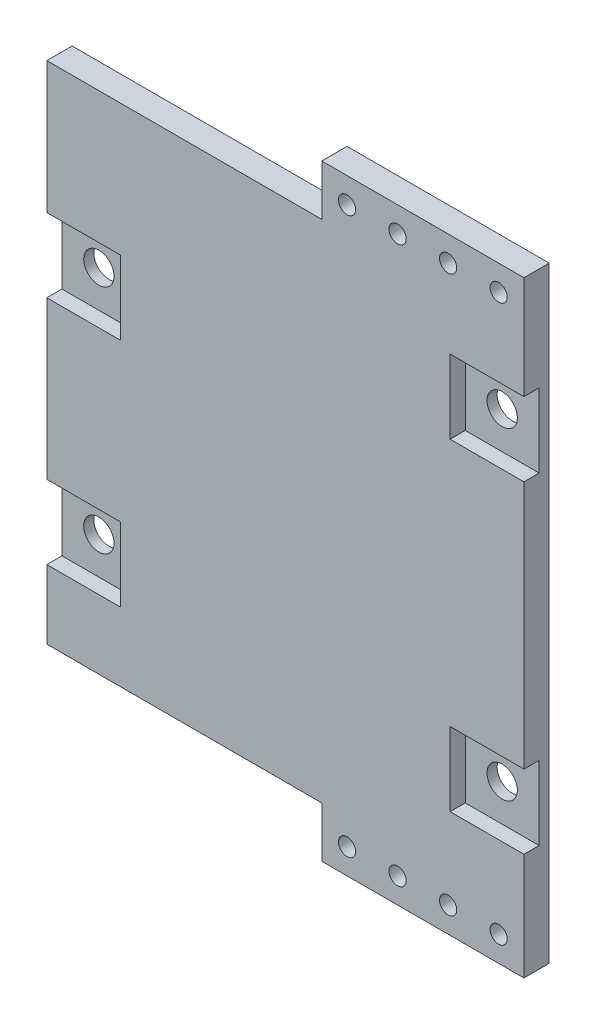
ISO-10303-21;
HEADER;
FILE_DESCRIPTION(('STEP AP214'),'2;1');
FILE_NAME('part.step','',(''),(''),'','','');
FILE_SCHEMA(('AUTOMOTIVE_DESIGN { 1 0 10303 214 1 1 1 1 }'));
ENDSEC;
DATA;
#1=APPLICATION_CONTEXT('core data for automotive mechanical design processes');
#2=APPLICATION_PROTOCOL_DEFINITION('international standard','automotive_design',2000,#1);
#3=PRODUCT_CONTEXT('',#1,'mechanical');
#4=PRODUCT('Part','Part','',(#3));
#5=PRODUCT_RELATED_PRODUCT_CATEGORY('part','',(#4));
#6=PRODUCT_DEFINITION_FORMATION('','',#4);
#7=PRODUCT_DEFINITION_CONTEXT('part definition',#1,'design');
#8=PRODUCT_DEFINITION('design','',#6,#7);
#9=PRODUCT_DEFINITION_SHAPE('','',#8);
#10=(LENGTH_UNIT() NAMED_UNIT(*) SI_UNIT(.MILLI.,.METRE.));
#11=(NAMED_UNIT(*) PLANE_ANGLE_UNIT() SI_UNIT($,.RADIAN.));
#12=(NAMED_UNIT(*) SI_UNIT($,.STERADIAN.) SOLID_ANGLE_UNIT());
#13=UNCERTAINTY_MEASURE_WITH_UNIT(LENGTH_MEASURE(1.E-05),#10,'distance_accuracy_value','');
#14=(GEOMETRIC_REPRESENTATION_CONTEXT(3) GLOBAL_UNCERTAINTY_ASSIGNED_CONTEXT((#13)) GLOBAL_UNIT_ASSIGNED_CONTEXT((#10,
#11,#12)) REPRESENTATION_CONTEXT('',''));
#15=CARTESIAN_POINT('',(0.,0.,0.));
#16=DIRECTION('',(0.,0.,1.));
#17=DIRECTION('',(1.,0.,0.));
#18=AXIS2_PLACEMENT_3D('',#15,#16,#17);
#19=CARTESIAN_POINT('',(0.,18.2402703944686,2.));
#20=DIRECTION('',(0.,1.,0.));
#21=DIRECTION('',(0.,0.,1.));
#22=AXIS2_PLACEMENT_3D('',#19,#20,#21);
#23=PLANE('',#22);
#24=DIRECTION('',(0.,0.,-1.));
#25=VECTOR('',#24,1.);
#26=CARTESIAN_POINT('',(122.334873735843,18.2402703944687,5.));
#27=LINE('',#26,#25);
#28=CARTESIAN_POINT('',(122.334873735843,18.2402703944686,5.));
#29=VERTEX_POINT('',#28);
#30=CARTESIAN_POINT('',(122.334873735843,18.2402703944687,0.));
#31=VERTEX_POINT('',#30);
#32=EDGE_CURVE('E54',#29,#31,#27,.T.);
#33=ORIENTED_EDGE('',*,*,#32,.F.);
#34=DIRECTION('',(1.,0.,0.));
#35=VECTOR('',#34,1.);
#36=CARTESIAN_POINT('',(0.,18.2402703944686,5.));
#37=LINE('',#36,#35);
#38=CARTESIAN_POINT('',(67.934873735843,18.2402703944686,5.));
#39=VERTEX_POINT('',#38);
#40=EDGE_CURVE('E335',#39,#29,#37,.T.);
#41=ORIENTED_EDGE('',*,*,#40,.F.);
#42=DIRECTION('',(0.,0.,-1.));
#43=VECTOR('',#42,1.);
#44=CARTESIAN_POINT('',(67.934873735843,18.2402703944686,2.));
#45=LINE('',#44,#43);
#46=CARTESIAN_POINT('',(67.934873735843,18.2402703944686,0.));
#47=VERTEX_POINT('',#46);
#48=EDGE_CURVE('E47',#39,#47,#45,.T.);
#49=ORIENTED_EDGE('',*,*,#48,.T.);
#50=DIRECTION('',(1.,0.,0.));
#51=VECTOR('',#50,1.);
#52=CARTESIAN_POINT('',(0.,18.2402703944686,0.));
#53=LINE('',#52,#51);
#54=EDGE_CURVE('E199',#47,#31,#53,.T.);
#55=ORIENTED_EDGE('',*,*,#54,.T.);
#56=EDGE_LOOP('',(#33,#41,#49,#55));
#57=FACE_BOUND('',#56,.T.);
#58=ADVANCED_FACE('F39',(#57),#23,.F.);
#59=CARTESIAN_POINT('',(0.,0.,2.));
#60=DIRECTION('',(0.,0.,1.));
#61=DIRECTION('',(1.,0.,0.));
#62=AXIS2_PLACEMENT_3D('',#59,#60,#61);
#63=PLANE('',#62);
#64=CARTESIAN_POINT('',(75.2348737358431,39.1802703944686,2.));
#65=DIRECTION('',(0.,0.,1.));
#66=DIRECTION('',(1.,0.,0.));
#67=AXIS2_PLACEMENT_3D('',#64,#65,#66);
#68=CIRCLE('',#67,3.00000000000001);
#69=CARTESIAN_POINT('',(78.2348737358431,39.1802703944686,2.));
#70=VERTEX_POINT('',#69);
#71=EDGE_CURVE('E417',#70,#70,#68,.T.);
#72=ORIENTED_EDGE('',*,*,#71,.F.);
#73=EDGE_LOOP('',(#72));
#74=FACE_BOUND('',#73,.T.);
#75=DIRECTION('',(0.,1.,0.));
#76=VECTOR('',#75,1.);
#77=CARTESIAN_POINT('',(67.934873735843,0.,2.));
#78=LINE('',#77,#76);
#79=CARTESIAN_POINT('',(67.934873735843,31.8802703944686,2.));
#80=VERTEX_POINT('',#79);
#81=CARTESIAN_POINT('',(67.934873735843,46.4802703944686,2.));
#82=VERTEX_POINT('',#81);
#83=EDGE_CURVE('E437',#80,#82,#78,.T.);
#84=ORIENTED_EDGE('',*,*,#83,.F.);
#85=DIRECTION('',(1.,0.,0.));
#86=VECTOR('',#85,1.);
#87=CARTESIAN_POINT('',(0.,31.8802703944686,2.));
#88=LINE('',#87,#86);
#89=CARTESIAN_POINT('',(82.534873735843,31.8802703944686,2.));
#90=VERTEX_POINT('',#89);
#91=EDGE_CURVE('E366',#80,#90,#88,.T.);
#92=ORIENTED_EDGE('',*,*,#91,.T.);
#93=DIRECTION('',(0.,1.,0.));
#94=VECTOR('',#93,1.);
#95=CARTESIAN_POINT('',(82.534873735843,0.,2.));
#96=LINE('',#95,#94);
#97=CARTESIAN_POINT('',(82.534873735843,46.4802703944686,2.));
#98=VERTEX_POINT('',#97);
#99=EDGE_CURVE('E364',#90,#98,#96,.T.);
#100=ORIENTED_EDGE('',*,*,#99,.T.);
#101=DIRECTION('',(1.,0.,0.));
#102=VECTOR('',#101,1.);
#103=CARTESIAN_POINT('',(0.,46.4802703944686,2.));
#104=LINE('',#103,#102);
#105=EDGE_CURVE('E361',#82,#98,#104,.T.);
#106=ORIENTED_EDGE('',*,*,#105,.F.);
#107=EDGE_LOOP('',(#84,#92,#100,#106));
#108=FACE_BOUND('',#107,.T.);
#109=ADVANCED_FACE('F525',(#74,#108),#63,.T.);
#110=CARTESIAN_POINT('',(75.2348737358431,84.9002703944686,2.));
#111=DIRECTION('',(0.,0.,1.));
#112=DIRECTION('',(1.,0.,0.));
#113=AXIS2_PLACEMENT_3D('',#110,#111,#112);
#114=CIRCLE('',#113,3.00000000000001);
#115=CARTESIAN_POINT('',(78.2348737358431,84.9002703944686,2.));
#116=VERTEX_POINT('',#115);
#117=EDGE_CURVE('E427',#116,#116,#114,.T.);
#118=ORIENTED_EDGE('',*,*,#117,.F.);
#119=EDGE_LOOP('',(#118));
#120=FACE_BOUND('',#119,.T.);
#121=CARTESIAN_POINT('',(67.934873735843,77.6002703944686,2.));
#122=VERTEX_POINT('',#121);
#123=CARTESIAN_POINT('',(67.934873735843,92.2002703944686,2.));
#124=VERTEX_POINT('',#123);
#125=EDGE_CURVE('E434',#122,#124,#78,.T.);
#126=ORIENTED_EDGE('',*,*,#125,.F.);
#127=DIRECTION('',(1.,0.,0.));
#128=VECTOR('',#127,1.);
#129=CARTESIAN_POINT('',(0.,77.6002703944687,2.));
#130=LINE('',#129,#128);
#131=CARTESIAN_POINT('',(82.534873735843,77.6002703944686,2.));
#132=VERTEX_POINT('',#131);
#133=EDGE_CURVE('E359',#122,#132,#130,.T.);
#134=ORIENTED_EDGE('',*,*,#133,.T.);
#135=DIRECTION('',(0.,1.,0.));
#136=VECTOR('',#135,1.);
#137=CARTESIAN_POINT('',(82.534873735843,0.,2.));
#138=LINE('',#137,#136);
#139=CARTESIAN_POINT('',(82.534873735843,92.2002703944686,2.));
#140=VERTEX_POINT('',#139);
#141=EDGE_CURVE('E357',#132,#140,#138,.T.);
#142=ORIENTED_EDGE('',*,*,#141,.T.);
#143=DIRECTION('',(1.,0.,0.));
#144=VECTOR('',#143,1.);
#145=CARTESIAN_POINT('',(0.,92.2002703944686,2.));
#146=LINE('',#145,#144);
#147=EDGE_CURVE('E354',#124,#140,#146,.T.);
#148=ORIENTED_EDGE('',*,*,#147,.F.);
#149=EDGE_LOOP('',(#126,#134,#142,#148));
#150=FACE_BOUND('',#149,.T.);
#151=ADVANCED_FACE('F557',(#120,#150),#63,.T.);
#152=CARTESIAN_POINT('',(155.034873735843,36.7402703944686,2.));
#153=DIRECTION('',(0.,0.,1.));
#154=DIRECTION('',(1.,0.,0.));
#155=AXIS2_PLACEMENT_3D('',#152,#153,#154);
#156=CIRCLE('',#155,3.00000000000002);
#157=CARTESIAN_POINT('',(158.034873735843,36.7402703944686,2.));
#158=VERTEX_POINT('',#157);
#159=EDGE_CURVE('E420',#158,#158,#156,.T.);
#160=ORIENTED_EDGE('',*,*,#159,.F.);
#161=EDGE_LOOP('',(#160));
#162=FACE_BOUND('',#161,.T.);
#163=DIRECTION('',(0.,1.,0.));
#164=VECTOR('',#163,1.);
#165=CARTESIAN_POINT('',(147.734873735843,0.,2.));
#166=LINE('',#165,#164);
#167=CARTESIAN_POINT('',(147.734873735843,29.4402703944686,2.));
#168=VERTEX_POINT('',#167);
#169=CARTESIAN_POINT('',(147.734873735843,44.0402703944686,2.));
#170=VERTEX_POINT('',#169);
#171=EDGE_CURVE('E292',#168,#170,#166,.T.);
#172=ORIENTED_EDGE('',*,*,#171,.F.);
#173=DIRECTION('',(1.,0.,0.));
#174=VECTOR('',#173,1.);
#175=CARTESIAN_POINT('',(0.,29.4402703944686,2.));
#176=LINE('',#175,#174);
#177=CARTESIAN_POINT('',(162.334873735843,29.4402703944686,2.));
#178=VERTEX_POINT('',#177);
#179=EDGE_CURVE('E300',#168,#178,#176,.T.);
#180=ORIENTED_EDGE('',*,*,#179,.T.);
#181=DIRECTION('',(0.,-1.,0.));
#182=VECTOR('',#181,1.);
#183=CARTESIAN_POINT('',(162.334873735843,0.,2.));
#184=LINE('',#183,#182);
#185=CARTESIAN_POINT('',(162.334873735843,44.0402703944686,2.));
#186=VERTEX_POINT('',#185);
#187=EDGE_CURVE('E430',#186,#178,#184,.T.);
#188=ORIENTED_EDGE('',*,*,#187,.F.);
#189=DIRECTION('',(1.,0.,0.));
#190=VECTOR('',#189,1.);
#191=CARTESIAN_POINT('',(0.,44.0402703944686,2.));
#192=LINE('',#191,#190);
#193=EDGE_CURVE('E343',#170,#186,#192,.T.);
#194=ORIENTED_EDGE('',*,*,#193,.F.);
#195=EDGE_LOOP('',(#172,#180,#188,#194));
#196=FACE_BOUND('',#195,.T.);
#197=ADVANCED_FACE('F526',(#162,#196),#63,.T.);
#198=CARTESIAN_POINT('',(162.334873735843,0.,2.));
#199=DIRECTION('',(1.,0.,0.));
#200=DIRECTION('',(0.,0.,-1.));
#201=AXIS2_PLACEMENT_3D('',#198,#199,#200);
#202=PLANE('',#201);
#203=DIRECTION('',(0.,-1.,0.));
#204=VECTOR('',#203,1.);
#205=CARTESIAN_POINT('',(162.334873735843,0.,0.));
#206=LINE('',#205,#204);
#207=CARTESIAN_POINT('',(162.334873735843,128.240270394469,0.));
#208=VERTEX_POINT('',#207);
#209=CARTESIAN_POINT('',(162.334873735843,8.24027039446865,0.));
#210=VERTEX_POINT('',#209);
#211=EDGE_CURVE('E204',#208,#210,#206,.T.);
#212=ORIENTED_EDGE('',*,*,#211,.F.);
#213=DIRECTION('',(0.,0.,-1.));
#214=VECTOR('',#213,1.);
#215=CARTESIAN_POINT('',(162.334873735843,128.240270394469,5.));
#216=LINE('',#215,#214);
#217=CARTESIAN_POINT('',(162.334873735843,128.240270394469,5.));
#218=VERTEX_POINT('',#217);
#219=EDGE_CURVE('E289',#218,#208,#216,.T.);
#220=ORIENTED_EDGE('',*,*,#219,.F.);
#221=DIRECTION('',(0.,1.,0.));
#222=VECTOR('',#221,1.);
#223=CARTESIAN_POINT('',(162.334873735843,0.,5.));
#224=LINE('',#223,#222);
#225=CARTESIAN_POINT('',(162.334873735843,107.860270394469,5.));
#226=VERTEX_POINT('',#225);
#227=EDGE_CURVE('E306',#226,#218,#224,.T.);
#228=ORIENTED_EDGE('',*,*,#227,.F.);
#229=DIRECTION('',(0.,0.,-1.));
#230=VECTOR('',#229,1.);
#231=CARTESIAN_POINT('',(162.334873735843,107.860270394469,5.));
#232=LINE('',#231,#230);
#233=CARTESIAN_POINT('',(162.334873735843,107.860270394469,2.));
#234=VERTEX_POINT('',#233);
#235=EDGE_CURVE('E398',#226,#234,#232,.T.);
#236=ORIENTED_EDGE('',*,*,#235,.T.);
#237=CARTESIAN_POINT('',(162.334873735843,93.2602703944686,2.));
#238=VERTEX_POINT('',#237);
#239=EDGE_CURVE('E433',#234,#238,#184,.T.);
#240=ORIENTED_EDGE('',*,*,#239,.T.);
#241=DIRECTION('',(0.,0.,-1.));
#242=VECTOR('',#241,1.);
#243=CARTESIAN_POINT('',(162.334873735843,93.2602703944686,5.));
#244=LINE('',#243,#242);
#245=CARTESIAN_POINT('',(162.334873735843,93.2602703944686,5.));
#246=VERTEX_POINT('',#245);
#247=EDGE_CURVE('E407',#246,#238,#244,.T.);
#248=ORIENTED_EDGE('',*,*,#247,.F.);
#249=CARTESIAN_POINT('',(162.334873735843,44.0402703944686,5.));
#250=VERTEX_POINT('',#249);
#251=EDGE_CURVE('E302',#250,#246,#224,.T.);
#252=ORIENTED_EDGE('',*,*,#251,.F.);
#253=DIRECTION('',(0.,0.,-1.));
#254=VECTOR('',#253,1.);
#255=CARTESIAN_POINT('',(162.334873735843,44.0402703944686,5.));
#256=LINE('',#255,#254);
#257=EDGE_CURVE('E410',#250,#186,#256,.T.);
#258=ORIENTED_EDGE('',*,*,#257,.T.);
#259=ORIENTED_EDGE('',*,*,#187,.T.);
#260=DIRECTION('',(0.,0.,-1.));
#261=VECTOR('',#260,1.);
#262=CARTESIAN_POINT('',(162.334873735843,29.4402703944686,5.));
#263=LINE('',#262,#261);
#264=CARTESIAN_POINT('',(162.334873735843,29.4402703944686,5.));
#265=VERTEX_POINT('',#264);
#266=EDGE_CURVE('E371',#265,#178,#263,.T.);
#267=ORIENTED_EDGE('',*,*,#266,.F.);
#268=CARTESIAN_POINT('',(162.334873735843,8.24027039446865,5.));
#269=VERTEX_POINT('',#268);
#270=EDGE_CURVE('E305',#269,#265,#224,.T.);
#271=ORIENTED_EDGE('',*,*,#270,.F.);
#272=DIRECTION('',(0.,0.,-1.));
#273=VECTOR('',#272,1.);
#274=CARTESIAN_POINT('',(162.334873735843,8.24027039446865,5.));
#275=LINE('',#274,#273);
#276=EDGE_CURVE('E229',#269,#210,#275,.T.);
#277=ORIENTED_EDGE('',*,*,#276,.T.);
#278=EDGE_LOOP('',(#212,#220,#228,#236,#240,#248,#252,#258,#259,#267,#271,#277));
#279=FACE_BOUND('',#278,.T.);
#280=ADVANCED_FACE('F488',(#279),#202,.T.);
#281=CARTESIAN_POINT('',(0.,118.240270394469,2.));
#282=DIRECTION('',(0.,-1.,0.));
#283=DIRECTION('',(0.,0.,-1.));
#284=AXIS2_PLACEMENT_3D('',#281,#282,#283);
#285=PLANE('',#284);
#286=DIRECTION('',(-1.,0.,0.));
#287=VECTOR('',#286,1.);
#288=CARTESIAN_POINT('',(0.,118.240270394469,5.));
#289=LINE('',#288,#287);
#290=CARTESIAN_POINT('',(122.334873735843,118.240270394469,5.));
#291=VERTEX_POINT('',#290);
#292=CARTESIAN_POINT('',(67.934873735843,118.240270394469,5.));
#293=VERTEX_POINT('',#292);
#294=EDGE_CURVE('E313',#291,#293,#289,.T.);
#295=ORIENTED_EDGE('',*,*,#294,.F.);
#296=DIRECTION('',(0.,0.,-1.));
#297=VECTOR('',#296,1.);
#298=CARTESIAN_POINT('',(122.334873735843,118.240270394469,5.));
#299=LINE('',#298,#297);
#300=CARTESIAN_POINT('',(122.334873735843,118.240270394469,0.));
#301=VERTEX_POINT('',#300);
#302=EDGE_CURVE('E285',#291,#301,#299,.T.);
#303=ORIENTED_EDGE('',*,*,#302,.T.);
#304=DIRECTION('',(-1.,0.,0.));
#305=VECTOR('',#304,1.);
#306=CARTESIAN_POINT('',(0.,118.240270394469,0.));
#307=LINE('',#306,#305);
#308=CARTESIAN_POINT('',(67.934873735843,118.240270394469,0.));
#309=VERTEX_POINT('',#308);
#310=EDGE_CURVE('E449',#301,#309,#307,.T.);
#311=ORIENTED_EDGE('',*,*,#310,.T.);
#312=DIRECTION('',(0.,0.,-1.));
#313=VECTOR('',#312,1.);
#314=CARTESIAN_POINT('',(67.934873735843,118.240270394469,2.));
#315=LINE('',#314,#313);
#316=EDGE_CURVE('E11',#293,#309,#315,.T.);
#317=ORIENTED_EDGE('',*,*,#316,.F.);
#318=EDGE_LOOP('',(#295,#303,#311,#317));
#319=FACE_BOUND('',#318,.T.);
#320=ADVANCED_FACE('F477',(#319),#285,.F.);
#321=CARTESIAN_POINT('',(75.2348737358431,84.9002703944686,2.));
#322=DIRECTION('',(0.,0.,-1.));
#323=DIRECTION('',(-1.,0.,0.));
#324=AXIS2_PLACEMENT_3D('',#321,#322,#323);
#325=CYLINDRICAL_SURFACE('',#324,3.00000000000001);
#326=ORIENTED_EDGE('',*,*,#117,.T.);
#327=EDGE_LOOP('',(#326));
#328=FACE_BOUND('',#327,.T.);
#329=CARTESIAN_POINT('',(75.2348737358431,84.9002703944686,0.));
#330=DIRECTION('',(0.,0.,1.));
#331=DIRECTION('',(1.,0.,0.));
#332=AXIS2_PLACEMENT_3D('',#329,#330,#331);
#333=CIRCLE('',#332,3.00000000000001);
#334=CARTESIAN_POINT('',(78.2348737358431,84.9002703944686,0.));
#335=VERTEX_POINT('',#334);
#336=EDGE_CURVE('E205',#335,#335,#333,.T.);
#337=ORIENTED_EDGE('',*,*,#336,.F.);
#338=EDGE_LOOP('',(#337));
#339=FACE_BOUND('',#338,.T.);
#340=ADVANCED_FACE('F533',(#328,#339),#325,.F.);
#341=CARTESIAN_POINT('',(155.034873735843,100.560270394469,2.));
#342=DIRECTION('',(0.,0.,-1.));
#343=DIRECTION('',(-1.,0.,0.));
#344=AXIS2_PLACEMENT_3D('',#341,#342,#343);
#345=CYLINDRICAL_SURFACE('',#344,3.00000000000002);
#346=CARTESIAN_POINT('',(155.034873735843,100.560270394469,2.));
#347=DIRECTION('',(0.,0.,1.));
#348=DIRECTION('',(1.,0.,0.));
#349=AXIS2_PLACEMENT_3D('',#346,#347,#348);
#350=CIRCLE('',#349,3.00000000000002);
#351=CARTESIAN_POINT('',(158.034873735843,100.560270394469,2.));
#352=VERTEX_POINT('',#351);
#353=EDGE_CURVE('E424',#352,#352,#350,.T.);
#354=ORIENTED_EDGE('',*,*,#353,.T.);
#355=EDGE_LOOP('',(#354));
#356=FACE_BOUND('',#355,.T.);
#357=CARTESIAN_POINT('',(155.034873735843,100.560270394469,0.));
#358=DIRECTION('',(0.,0.,1.));
#359=DIRECTION('',(1.,0.,0.));
#360=AXIS2_PLACEMENT_3D('',#357,#358,#359);
#361=CIRCLE('',#360,3.00000000000002);
#362=CARTESIAN_POINT('',(158.034873735843,100.560270394469,0.));
#363=VERTEX_POINT('',#362);
#364=EDGE_CURVE('E443',#363,#363,#361,.T.);
#365=ORIENTED_EDGE('',*,*,#364,.F.);
#366=EDGE_LOOP('',(#365));
#367=FACE_BOUND('',#366,.T.);
#368=ADVANCED_FACE('F529',(#356,#367),#345,.F.);
#369=CARTESIAN_POINT('',(155.034873735843,36.7402703944686,2.));
#370=DIRECTION('',(0.,0.,-1.));
#371=DIRECTION('',(-1.,0.,0.));
#372=AXIS2_PLACEMENT_3D('',#369,#370,#371);
#373=CYLINDRICAL_SURFACE('',#372,3.00000000000002);
#374=ORIENTED_EDGE('',*,*,#159,.T.);
#375=EDGE_LOOP('',(#374));
#376=FACE_BOUND('',#375,.T.);
#377=CARTESIAN_POINT('',(155.034873735843,36.7402703944686,0.));
#378=DIRECTION('',(0.,0.,1.));
#379=DIRECTION('',(1.,0.,0.));
#380=AXIS2_PLACEMENT_3D('',#377,#378,#379);
#381=CIRCLE('',#380,3.00000000000002);
#382=CARTESIAN_POINT('',(158.034873735843,36.7402703944686,0.));
#383=VERTEX_POINT('',#382);
#384=EDGE_CURVE('E440',#383,#383,#381,.T.);
#385=ORIENTED_EDGE('',*,*,#384,.F.);
#386=EDGE_LOOP('',(#385));
#387=FACE_BOUND('',#386,.T.);
#388=ADVANCED_FACE('F532',(#376,#387),#373,.F.);
#389=CARTESIAN_POINT('',(75.2348737358431,39.1802703944686,2.));
#390=DIRECTION('',(0.,0.,-1.));
#391=DIRECTION('',(-1.,0.,0.));
#392=AXIS2_PLACEMENT_3D('',#389,#390,#391);
#393=CYLINDRICAL_SURFACE('',#392,3.00000000000001);
#394=ORIENTED_EDGE('',*,*,#71,.T.);
#395=EDGE_LOOP('',(#394));
#396=FACE_BOUND('',#395,.T.);
#397=CARTESIAN_POINT('',(75.2348737358431,39.1802703944686,0.));
#398=DIRECTION('',(0.,0.,1.));
#399=DIRECTION('',(1.,0.,0.));
#400=AXIS2_PLACEMENT_3D('',#397,#398,#399);
#401=CIRCLE('',#400,3.00000000000001);
#402=CARTESIAN_POINT('',(78.2348737358431,39.1802703944686,0.));
#403=VERTEX_POINT('',#402);
#404=EDGE_CURVE('E416',#403,#403,#401,.T.);
#405=ORIENTED_EDGE('',*,*,#404,.F.);
#406=EDGE_LOOP('',(#405));
#407=FACE_BOUND('',#406,.T.);
#408=ADVANCED_FACE('F41',(#396,#407),#393,.F.);
#409=CARTESIAN_POINT('',(67.934873735843,0.,2.));
#410=DIRECTION('',(-1.,0.,0.));
#411=DIRECTION('',(0.,0.,1.));
#412=AXIS2_PLACEMENT_3D('',#409,#410,#411);
#413=PLANE('',#412);
#414=DIRECTION('',(0.,1.,0.));
#415=VECTOR('',#414,1.);
#416=CARTESIAN_POINT('',(67.934873735843,0.,0.));
#417=LINE('',#416,#415);
#418=EDGE_CURVE('E421',#47,#309,#417,.T.);
#419=ORIENTED_EDGE('',*,*,#418,.F.);
#420=ORIENTED_EDGE('',*,*,#48,.F.);
#421=DIRECTION('',(0.,-1.,0.));
#422=VECTOR('',#421,1.);
#423=CARTESIAN_POINT('',(67.934873735843,0.,5.));
#424=LINE('',#423,#422);
#425=CARTESIAN_POINT('',(67.934873735843,31.8802703944686,5.));
#426=VERTEX_POINT('',#425);
#427=EDGE_CURVE('E318',#426,#39,#424,.T.);
#428=ORIENTED_EDGE('',*,*,#427,.F.);
#429=DIRECTION('',(0.,0.,-1.));
#430=VECTOR('',#429,1.);
#431=CARTESIAN_POINT('',(67.934873735843,31.8802703944686,5.));
#432=LINE('',#431,#430);
#433=EDGE_CURVE('E374',#426,#80,#432,.T.);
#434=ORIENTED_EDGE('',*,*,#433,.T.);
#435=ORIENTED_EDGE('',*,*,#83,.T.);
#436=DIRECTION('',(0.,0.,-1.));
#437=VECTOR('',#436,1.);
#438=CARTESIAN_POINT('',(67.934873735843,46.4802703944686,5.));
#439=LINE('',#438,#437);
#440=CARTESIAN_POINT('',(67.934873735843,46.4802703944686,5.));
#441=VERTEX_POINT('',#440);
#442=EDGE_CURVE('E383',#441,#82,#439,.T.);
#443=ORIENTED_EDGE('',*,*,#442,.F.);
#444=CARTESIAN_POINT('',(67.934873735843,77.6002703944686,5.));
#445=VERTEX_POINT('',#444);
#446=EDGE_CURVE('E319',#445,#441,#424,.T.);
#447=ORIENTED_EDGE('',*,*,#446,.F.);
#448=DIRECTION('',(0.,0.,-1.));
#449=VECTOR('',#448,1.);
#450=CARTESIAN_POINT('',(67.934873735843,77.6002703944686,5.));
#451=LINE('',#450,#449);
#452=EDGE_CURVE('E386',#445,#122,#451,.T.);
#453=ORIENTED_EDGE('',*,*,#452,.T.);
#454=ORIENTED_EDGE('',*,*,#125,.T.);
#455=DIRECTION('',(0.,0.,-1.));
#456=VECTOR('',#455,1.);
#457=CARTESIAN_POINT('',(67.934873735843,92.2002703944686,5.));
#458=LINE('',#457,#456);
#459=CARTESIAN_POINT('',(67.934873735843,92.2002703944686,5.));
#460=VERTEX_POINT('',#459);
#461=EDGE_CURVE('E395',#460,#124,#458,.T.);
#462=ORIENTED_EDGE('',*,*,#461,.F.);
#463=EDGE_CURVE('E315',#293,#460,#424,.T.);
#464=ORIENTED_EDGE('',*,*,#463,.F.);
#465=ORIENTED_EDGE('',*,*,#316,.T.);
#466=EDGE_LOOP('',(#419,#420,#428,#434,#435,#443,#447,#453,#454,#462,#464,#465));
#467=FACE_BOUND('',#466,.T.);
#468=ADVANCED_FACE('F454',(#467),#413,.T.);
#469=DIRECTION('',(1.,0.,0.));
#470=VECTOR('',#469,1.);
#471=CARTESIAN_POINT('',(0.,107.860270394469,2.));
#472=LINE('',#471,#470);
#473=CARTESIAN_POINT('',(147.734873735843,107.860270394469,2.));
#474=VERTEX_POINT('',#473);
#475=EDGE_CURVE('E351',#474,#234,#472,.T.);
#476=ORIENTED_EDGE('',*,*,#475,.F.);
#477=DIRECTION('',(0.,1.,0.));
#478=VECTOR('',#477,1.);
#479=CARTESIAN_POINT('',(147.734873735843,0.,2.));
#480=LINE('',#479,#478);
#481=CARTESIAN_POINT('',(147.734873735843,93.2602703944686,2.));
#482=VERTEX_POINT('',#481);
#483=EDGE_CURVE('E348',#482,#474,#480,.T.);
#484=ORIENTED_EDGE('',*,*,#483,.F.);
#485=DIRECTION('',(1.,0.,0.));
#486=VECTOR('',#485,1.);
#487=CARTESIAN_POINT('',(0.,93.2602703944686,2.));
#488=LINE('',#487,#486);
#489=EDGE_CURVE('E346',#482,#238,#488,.T.);
#490=ORIENTED_EDGE('',*,*,#489,.T.);
#491=ORIENTED_EDGE('',*,*,#239,.F.);
#492=EDGE_LOOP('',(#476,#484,#490,#491));
#493=FACE_BOUND('',#492,.T.);
#494=ORIENTED_EDGE('',*,*,#353,.F.);
#495=EDGE_LOOP('',(#494));
#496=FACE_BOUND('',#495,.T.);
#497=ADVANCED_FACE('F521',(#493,#496),#63,.T.);
#498=CARTESIAN_POINT('',(0.,0.,0.));
#499=DIRECTION('',(0.,0.,1.));
#500=DIRECTION('',(1.,0.,0.));
#501=AXIS2_PLACEMENT_3D('',#498,#499,#500);
#502=PLANE('',#501);
#503=ORIENTED_EDGE('',*,*,#404,.T.);
#504=EDGE_LOOP('',(#503));
#505=FACE_BOUND('',#504,.T.);
#506=ORIENTED_EDGE('',*,*,#384,.T.);
#507=EDGE_LOOP('',(#506));
#508=FACE_BOUND('',#507,.T.);
#509=ORIENTED_EDGE('',*,*,#364,.T.);
#510=EDGE_LOOP('',(#509));
#511=FACE_BOUND('',#510,.T.);
#512=ORIENTED_EDGE('',*,*,#336,.T.);
#513=EDGE_LOOP('',(#512));
#514=FACE_BOUND('',#513,.T.);
#515=ORIENTED_EDGE('',*,*,#54,.F.);
#516=ORIENTED_EDGE('',*,*,#418,.T.);
#517=ORIENTED_EDGE('',*,*,#310,.F.);
#518=DIRECTION('',(0.,1.,0.));
#519=VECTOR('',#518,1.);
#520=CARTESIAN_POINT('',(122.334873735843,118.240270394469,0.));
#521=LINE('',#520,#519);
#522=CARTESIAN_POINT('',(122.334873735843,128.240270394469,0.));
#523=VERTEX_POINT('',#522);
#524=EDGE_CURVE('E62',#301,#523,#521,.T.);
#525=ORIENTED_EDGE('',*,*,#524,.T.);
#526=DIRECTION('',(1.,0.,0.));
#527=VECTOR('',#526,1.);
#528=CARTESIAN_POINT('',(162.334873735843,128.240270394469,0.));
#529=LINE('',#528,#527);
#530=EDGE_CURVE('E282',#523,#208,#529,.T.);
#531=ORIENTED_EDGE('',*,*,#530,.T.);
#532=ORIENTED_EDGE('',*,*,#211,.T.);
#533=DIRECTION('',(-1.,0.,0.));
#534=VECTOR('',#533,1.);
#535=CARTESIAN_POINT('',(162.334873735843,8.24027039446865,0.));
#536=LINE('',#535,#534);
#537=CARTESIAN_POINT('',(122.334873735843,8.24027039446865,0.));
#538=VERTEX_POINT('',#537);
#539=EDGE_CURVE('E220',#210,#538,#536,.T.);
#540=ORIENTED_EDGE('',*,*,#539,.T.);
#541=DIRECTION('',(0.,1.,0.));
#542=VECTOR('',#541,1.);
#543=CARTESIAN_POINT('',(122.334873735843,8.24027039446865,0.));
#544=LINE('',#543,#542);
#545=EDGE_CURVE('E211',#538,#31,#544,.T.);
#546=ORIENTED_EDGE('',*,*,#545,.T.);
#547=EDGE_LOOP('',(#515,#516,#517,#525,#531,#532,#540,#546));
#548=FACE_BOUND('',#547,.T.);
#549=CARTESIAN_POINT('',(127.334873735843,123.240270394469,0.));
#550=DIRECTION('',(0.,0.,-1.));
#551=DIRECTION('',(-1.,0.,0.));
#552=AXIS2_PLACEMENT_3D('',#549,#550,#551);
#553=CIRCLE('',#552,1.70000000000001);
#554=CARTESIAN_POINT('',(125.634873735843,123.240270394469,0.));
#555=VERTEX_POINT('',#554);
#556=EDGE_CURVE('E252',#555,#555,#553,.T.);
#557=ORIENTED_EDGE('',*,*,#556,.F.);
#558=EDGE_LOOP('',(#557));
#559=FACE_BOUND('',#558,.T.);
#560=CARTESIAN_POINT('',(137.334873735843,123.240270394469,0.));
#561=DIRECTION('',(0.,0.,-1.));
#562=DIRECTION('',(-1.,0.,0.));
#563=AXIS2_PLACEMENT_3D('',#560,#561,#562);
#564=CIRCLE('',#563,1.70000000000001);
#565=CARTESIAN_POINT('',(135.634873735843,123.240270394469,0.));
#566=VERTEX_POINT('',#565);
#567=EDGE_CURVE('E258',#566,#566,#564,.T.);
#568=ORIENTED_EDGE('',*,*,#567,.F.);
#569=EDGE_LOOP('',(#568));
#570=FACE_BOUND('',#569,.T.);
#571=CARTESIAN_POINT('',(147.334873735843,123.240270394469,0.));
#572=DIRECTION('',(0.,0.,-1.));
#573=DIRECTION('',(-1.,0.,0.));
#574=AXIS2_PLACEMENT_3D('',#571,#572,#573);
#575=CIRCLE('',#574,1.70000000000001);
#576=CARTESIAN_POINT('',(145.634873735843,123.240270394469,0.));
#577=VERTEX_POINT('',#576);
#578=EDGE_CURVE('E264',#577,#577,#575,.T.);
#579=ORIENTED_EDGE('',*,*,#578,.F.);
#580=EDGE_LOOP('',(#579));
#581=FACE_BOUND('',#580,.T.);
#582=CARTESIAN_POINT('',(157.334873735843,123.240270394469,0.));
#583=DIRECTION('',(0.,0.,-1.));
#584=DIRECTION('',(-1.,0.,0.));
#585=AXIS2_PLACEMENT_3D('',#582,#583,#584);
#586=CIRCLE('',#585,1.70000000000001);
#587=CARTESIAN_POINT('',(155.634873735843,123.240270394469,0.));
#588=VERTEX_POINT('',#587);
#589=EDGE_CURVE('E270',#588,#588,#586,.T.);
#590=ORIENTED_EDGE('',*,*,#589,.F.);
#591=EDGE_LOOP('',(#590));
#592=FACE_BOUND('',#591,.T.);
#593=CARTESIAN_POINT('',(127.334873735843,13.2402703944687,0.));
#594=DIRECTION('',(0.,0.,-1.));
#595=DIRECTION('',(-1.,0.,0.));
#596=AXIS2_PLACEMENT_3D('',#593,#594,#595);
#597=CIRCLE('',#596,1.70000000000001);
#598=CARTESIAN_POINT('',(125.634873735843,13.2402703944687,0.));
#599=VERTEX_POINT('',#598);
#600=EDGE_CURVE('E249',#599,#599,#597,.T.);
#601=ORIENTED_EDGE('',*,*,#600,.F.);
#602=EDGE_LOOP('',(#601));
#603=FACE_BOUND('',#602,.T.);
#604=CARTESIAN_POINT('',(137.334873735843,13.2402703944687,0.));
#605=DIRECTION('',(0.,0.,-1.));
#606=DIRECTION('',(-1.,0.,0.));
#607=AXIS2_PLACEMENT_3D('',#604,#605,#606);
#608=CIRCLE('',#607,1.70000000000001);
#609=CARTESIAN_POINT('',(135.634873735843,13.2402703944687,0.));
#610=VERTEX_POINT('',#609);
#611=EDGE_CURVE('E243',#610,#610,#608,.T.);
#612=ORIENTED_EDGE('',*,*,#611,.F.);
#613=EDGE_LOOP('',(#612));
#614=FACE_BOUND('',#613,.T.);
#615=CARTESIAN_POINT('',(147.334873735843,13.2402703944687,0.));
#616=DIRECTION('',(0.,0.,-1.));
#617=DIRECTION('',(-1.,0.,0.));
#618=AXIS2_PLACEMENT_3D('',#615,#616,#617);
#619=CIRCLE('',#618,1.70000000000001);
#620=CARTESIAN_POINT('',(145.634873735843,13.2402703944687,0.));
#621=VERTEX_POINT('',#620);
#622=EDGE_CURVE('E237',#621,#621,#619,.T.);
#623=ORIENTED_EDGE('',*,*,#622,.F.);
#624=EDGE_LOOP('',(#623));
#625=FACE_BOUND('',#624,.T.);
#626=CARTESIAN_POINT('',(157.334873735843,13.2402703944687,0.));
#627=DIRECTION('',(0.,0.,-1.));
#628=DIRECTION('',(-1.,0.,0.));
#629=AXIS2_PLACEMENT_3D('',#626,#627,#628);
#630=CIRCLE('',#629,1.70000000000001);
#631=CARTESIAN_POINT('',(155.634873735843,13.2402703944687,0.));
#632=VERTEX_POINT('',#631);
#633=EDGE_CURVE('E231',#632,#632,#630,.T.);
#634=ORIENTED_EDGE('',*,*,#633,.F.);
#635=EDGE_LOOP('',(#634));
#636=FACE_BOUND('',#635,.T.);
#637=ADVANCED_FACE('F217',(#505,#508,#511,#514,#548,#559,#570,#581,#592,#603,#614,#625,#636),
#502,.F.);
#638=CARTESIAN_POINT('',(147.734873735843,0.,5.));
#639=DIRECTION('',(-1.,0.,0.));
#640=DIRECTION('',(0.,0.,1.));
#641=AXIS2_PLACEMENT_3D('',#638,#639,#640);
#642=PLANE('',#641);
#643=ORIENTED_EDGE('',*,*,#171,.T.);
#644=DIRECTION('',(0.,0.,-1.));
#645=VECTOR('',#644,1.);
#646=CARTESIAN_POINT('',(147.734873735843,44.0402703944686,5.));
#647=LINE('',#646,#645);
#648=CARTESIAN_POINT('',(147.734873735843,44.0402703944686,5.));
#649=VERTEX_POINT('',#648);
#650=EDGE_CURVE('E413',#649,#170,#647,.T.);
#651=ORIENTED_EDGE('',*,*,#650,.F.);
#652=DIRECTION('',(0.,1.,0.));
#653=VECTOR('',#652,1.);
#654=CARTESIAN_POINT('',(147.734873735843,0.,5.));
#655=LINE('',#654,#653);
#656=CARTESIAN_POINT('',(147.734873735843,29.4402703944686,5.));
#657=VERTEX_POINT('',#656);
#658=EDGE_CURVE('E296',#657,#649,#655,.T.);
#659=ORIENTED_EDGE('',*,*,#658,.F.);
#660=DIRECTION('',(0.,0.,-1.));
#661=VECTOR('',#660,1.);
#662=CARTESIAN_POINT('',(147.734873735843,29.4402703944686,5.));
#663=LINE('',#662,#661);
#664=EDGE_CURVE('E340',#657,#168,#663,.T.);
#665=ORIENTED_EDGE('',*,*,#664,.T.);
#666=EDGE_LOOP('',(#643,#651,#659,#665));
#667=FACE_BOUND('',#666,.T.);
#668=ADVANCED_FACE('F501',(#667),#642,.F.);
#669=CARTESIAN_POINT('',(0.,44.0402703944686,5.));
#670=DIRECTION('',(0.,1.,0.));
#671=DIRECTION('',(0.,0.,1.));
#672=AXIS2_PLACEMENT_3D('',#669,#670,#671);
#673=PLANE('',#672);
#674=ORIENTED_EDGE('',*,*,#193,.T.);
#675=ORIENTED_EDGE('',*,*,#257,.F.);
#676=DIRECTION('',(1.,0.,0.));
#677=VECTOR('',#676,1.);
#678=CARTESIAN_POINT('',(0.,44.0402703944686,5.));
#679=LINE('',#678,#677);
#680=EDGE_CURVE('E299',#649,#250,#679,.T.);
#681=ORIENTED_EDGE('',*,*,#680,.F.);
#682=ORIENTED_EDGE('',*,*,#650,.T.);
#683=EDGE_LOOP('',(#674,#675,#681,#682));
#684=FACE_BOUND('',#683,.T.);
#685=ADVANCED_FACE('F507',(#684),#673,.F.);
#686=CARTESIAN_POINT('',(0.,93.2602703944686,5.));
#687=DIRECTION('',(0.,1.,0.));
#688=DIRECTION('',(0.,0.,1.));
#689=AXIS2_PLACEMENT_3D('',#686,#687,#688);
#690=PLANE('',#689);
#691=ORIENTED_EDGE('',*,*,#489,.F.);
#692=DIRECTION('',(0.,0.,-1.));
#693=VECTOR('',#692,1.);
#694=CARTESIAN_POINT('',(147.734873735843,93.2602703944686,5.));
#695=LINE('',#694,#693);
#696=CARTESIAN_POINT('',(147.734873735843,93.2602703944686,5.));
#697=VERTEX_POINT('',#696);
#698=EDGE_CURVE('E404',#697,#482,#695,.T.);
#699=ORIENTED_EDGE('',*,*,#698,.F.);
#700=DIRECTION('',(1.,0.,0.));
#701=VECTOR('',#700,1.);
#702=CARTESIAN_POINT('',(0.,93.2602703944686,5.));
#703=LINE('',#702,#701);
#704=EDGE_CURVE('E304',#697,#246,#703,.T.);
#705=ORIENTED_EDGE('',*,*,#704,.T.);
#706=ORIENTED_EDGE('',*,*,#247,.T.);
#707=EDGE_LOOP('',(#691,#699,#705,#706));
#708=FACE_BOUND('',#707,.T.);
#709=ADVANCED_FACE('F511',(#708),#690,.T.);
#710=CARTESIAN_POINT('',(147.734873735843,0.,5.));
#711=DIRECTION('',(-1.,0.,0.));
#712=DIRECTION('',(0.,0.,1.));
#713=AXIS2_PLACEMENT_3D('',#710,#711,#712);
#714=PLANE('',#713);
#715=ORIENTED_EDGE('',*,*,#483,.T.);
#716=DIRECTION('',(0.,0.,-1.));
#717=VECTOR('',#716,1.);
#718=CARTESIAN_POINT('',(147.734873735843,107.860270394469,5.));
#719=LINE('',#718,#717);
#720=CARTESIAN_POINT('',(147.734873735843,107.860270394469,5.));
#721=VERTEX_POINT('',#720);
#722=EDGE_CURVE('E401',#721,#474,#719,.T.);
#723=ORIENTED_EDGE('',*,*,#722,.F.);
#724=DIRECTION('',(0.,1.,0.));
#725=VECTOR('',#724,1.);
#726=CARTESIAN_POINT('',(147.734873735843,0.,5.));
#727=LINE('',#726,#725);
#728=EDGE_CURVE('E309',#697,#721,#727,.T.);
#729=ORIENTED_EDGE('',*,*,#728,.F.);
#730=ORIENTED_EDGE('',*,*,#698,.T.);
#731=EDGE_LOOP('',(#715,#723,#729,#730));
#732=FACE_BOUND('',#731,.T.);
#733=ADVANCED_FACE('F517',(#732),#714,.F.);
#734=CARTESIAN_POINT('',(0.,107.860270394469,5.));
#735=DIRECTION('',(0.,1.,0.));
#736=DIRECTION('',(0.,0.,1.));
#737=AXIS2_PLACEMENT_3D('',#734,#735,#736);
#738=PLANE('',#737);
#739=ORIENTED_EDGE('',*,*,#475,.T.);
#740=ORIENTED_EDGE('',*,*,#235,.F.);
#741=DIRECTION('',(1.,0.,0.));
#742=VECTOR('',#741,1.);
#743=CARTESIAN_POINT('',(0.,107.860270394469,5.));
#744=LINE('',#743,#742);
#745=EDGE_CURVE('E311',#721,#226,#744,.T.);
#746=ORIENTED_EDGE('',*,*,#745,.F.);
#747=ORIENTED_EDGE('',*,*,#722,.T.);
#748=EDGE_LOOP('',(#739,#740,#746,#747));
#749=FACE_BOUND('',#748,.T.);
#750=ADVANCED_FACE('F519',(#749),#738,.F.);
#751=CARTESIAN_POINT('',(0.,92.2002703944686,5.));
#752=DIRECTION('',(0.,1.,0.));
#753=DIRECTION('',(0.,0.,1.));
#754=AXIS2_PLACEMENT_3D('',#751,#752,#753);
#755=PLANE('',#754);
#756=ORIENTED_EDGE('',*,*,#147,.T.);
#757=DIRECTION('',(0.,0.,-1.));
#758=VECTOR('',#757,1.);
#759=CARTESIAN_POINT('',(82.534873735843,92.2002703944686,5.));
#760=LINE('',#759,#758);
#761=CARTESIAN_POINT('',(82.534873735843,92.2002703944686,5.));
#762=VERTEX_POINT('',#761);
#763=EDGE_CURVE('E392',#762,#140,#760,.T.);
#764=ORIENTED_EDGE('',*,*,#763,.F.);
#765=DIRECTION('',(1.,0.,0.));
#766=VECTOR('',#765,1.);
#767=CARTESIAN_POINT('',(0.,92.2002703944686,5.));
#768=LINE('',#767,#766);
#769=EDGE_CURVE('E317',#460,#762,#768,.T.);
#770=ORIENTED_EDGE('',*,*,#769,.F.);
#771=ORIENTED_EDGE('',*,*,#461,.T.);
#772=EDGE_LOOP('',(#756,#764,#770,#771));
#773=FACE_BOUND('',#772,.T.);
#774=ADVANCED_FACE('F573',(#773),#755,.F.);
#775=CARTESIAN_POINT('',(82.534873735843,0.,5.));
#776=DIRECTION('',(-1.,0.,0.));
#777=DIRECTION('',(0.,0.,1.));
#778=AXIS2_PLACEMENT_3D('',#775,#776,#777);
#779=PLANE('',#778);
#780=ORIENTED_EDGE('',*,*,#141,.F.);
#781=DIRECTION('',(0.,0.,-1.));
#782=VECTOR('',#781,1.);
#783=CARTESIAN_POINT('',(82.534873735843,77.6002703944686,5.));
#784=LINE('',#783,#782);
#785=CARTESIAN_POINT('',(82.534873735843,77.6002703944686,5.));
#786=VERTEX_POINT('',#785);
#787=EDGE_CURVE('E389',#786,#132,#784,.T.);
#788=ORIENTED_EDGE('',*,*,#787,.F.);
#789=DIRECTION('',(0.,1.,0.));
#790=VECTOR('',#789,1.);
#791=CARTESIAN_POINT('',(82.534873735843,0.,5.));
#792=LINE('',#791,#790);
#793=EDGE_CURVE('E321',#786,#762,#792,.T.);
#794=ORIENTED_EDGE('',*,*,#793,.T.);
#795=ORIENTED_EDGE('',*,*,#763,.T.);
#796=EDGE_LOOP('',(#780,#788,#794,#795));
#797=FACE_BOUND('',#796,.T.);
#798=ADVANCED_FACE('F576',(#797),#779,.T.);
#799=CARTESIAN_POINT('',(0.,77.6002703944687,5.));
#800=DIRECTION('',(0.,1.,0.));
#801=DIRECTION('',(-1.,0.,0.));
#802=AXIS2_PLACEMENT_3D('',#799,#800,#801);
#803=PLANE('',#802);
#804=ORIENTED_EDGE('',*,*,#133,.F.);
#805=ORIENTED_EDGE('',*,*,#452,.F.);
#806=DIRECTION('',(1.,0.,0.));
#807=VECTOR('',#806,1.);
#808=CARTESIAN_POINT('',(0.,77.6002703944687,5.));
#809=LINE('',#808,#807);
#810=EDGE_CURVE('E324',#445,#786,#809,.T.);
#811=ORIENTED_EDGE('',*,*,#810,.T.);
#812=ORIENTED_EDGE('',*,*,#787,.T.);
#813=EDGE_LOOP('',(#804,#805,#811,#812));
#814=FACE_BOUND('',#813,.T.);
#815=ADVANCED_FACE('F580',(#814),#803,.T.);
#816=CARTESIAN_POINT('',(0.,46.4802703944686,5.));
#817=DIRECTION('',(0.,1.,0.));
#818=DIRECTION('',(0.,0.,1.));
#819=AXIS2_PLACEMENT_3D('',#816,#817,#818);
#820=PLANE('',#819);
#821=ORIENTED_EDGE('',*,*,#105,.T.);
#822=DIRECTION('',(0.,0.,-1.));
#823=VECTOR('',#822,1.);
#824=CARTESIAN_POINT('',(82.534873735843,46.4802703944686,5.));
#825=LINE('',#824,#823);
#826=CARTESIAN_POINT('',(82.534873735843,46.4802703944686,5.));
#827=VERTEX_POINT('',#826);
#828=EDGE_CURVE('E380',#827,#98,#825,.T.);
#829=ORIENTED_EDGE('',*,*,#828,.F.);
#830=DIRECTION('',(1.,0.,0.));
#831=VECTOR('',#830,1.);
#832=CARTESIAN_POINT('',(0.,46.4802703944686,5.));
#833=LINE('',#832,#831);
#834=EDGE_CURVE('E327',#441,#827,#833,.T.);
#835=ORIENTED_EDGE('',*,*,#834,.F.);
#836=ORIENTED_EDGE('',*,*,#442,.T.);
#837=EDGE_LOOP('',(#821,#829,#835,#836));
#838=FACE_BOUND('',#837,.T.);
#839=ADVANCED_FACE('F461',(#838),#820,.F.);
#840=CARTESIAN_POINT('',(82.534873735843,0.,5.));
#841=DIRECTION('',(-1.,0.,0.));
#842=DIRECTION('',(0.,0.,1.));
#843=AXIS2_PLACEMENT_3D('',#840,#841,#842);
#844=PLANE('',#843);
#845=ORIENTED_EDGE('',*,*,#99,.F.);
#846=DIRECTION('',(0.,0.,-1.));
#847=VECTOR('',#846,1.);
#848=CARTESIAN_POINT('',(82.534873735843,31.8802703944686,5.));
#849=LINE('',#848,#847);
#850=CARTESIAN_POINT('',(82.534873735843,31.8802703944686,5.));
#851=VERTEX_POINT('',#850);
#852=EDGE_CURVE('E377',#851,#90,#849,.T.);
#853=ORIENTED_EDGE('',*,*,#852,.F.);
#854=DIRECTION('',(0.,1.,0.));
#855=VECTOR('',#854,1.);
#856=CARTESIAN_POINT('',(82.534873735843,0.,5.));
#857=LINE('',#856,#855);
#858=EDGE_CURVE('E329',#851,#827,#857,.T.);
#859=ORIENTED_EDGE('',*,*,#858,.T.);
#860=ORIENTED_EDGE('',*,*,#828,.T.);
#861=EDGE_LOOP('',(#845,#853,#859,#860));
#862=FACE_BOUND('',#861,.T.);
#863=ADVANCED_FACE('F587',(#862),#844,.T.);
#864=CARTESIAN_POINT('',(0.,31.8802703944686,5.));
#865=DIRECTION('',(0.,1.,0.));
#866=DIRECTION('',(-1.,0.,0.));
#867=AXIS2_PLACEMENT_3D('',#864,#865,#866);
#868=PLANE('',#867);
#869=ORIENTED_EDGE('',*,*,#91,.F.);
#870=ORIENTED_EDGE('',*,*,#433,.F.);
#871=DIRECTION('',(1.,0.,0.));
#872=VECTOR('',#871,1.);
#873=CARTESIAN_POINT('',(0.,31.8802703944686,5.));
#874=LINE('',#873,#872);
#875=EDGE_CURVE('E332',#426,#851,#874,.T.);
#876=ORIENTED_EDGE('',*,*,#875,.T.);
#877=ORIENTED_EDGE('',*,*,#852,.T.);
#878=EDGE_LOOP('',(#869,#870,#876,#877));
#879=FACE_BOUND('',#878,.T.);
#880=ADVANCED_FACE('F590',(#879),#868,.T.);
#881=CARTESIAN_POINT('',(0.,29.4402703944686,5.));
#882=DIRECTION('',(0.,1.,0.));
#883=DIRECTION('',(0.,0.,1.));
#884=AXIS2_PLACEMENT_3D('',#881,#882,#883);
#885=PLANE('',#884);
#886=ORIENTED_EDGE('',*,*,#179,.F.);
#887=ORIENTED_EDGE('',*,*,#664,.F.);
#888=DIRECTION('',(1.,0.,0.));
#889=VECTOR('',#888,1.);
#890=CARTESIAN_POINT('',(0.,29.4402703944686,5.));
#891=LINE('',#890,#889);
#892=EDGE_CURVE('E337',#657,#265,#891,.T.);
#893=ORIENTED_EDGE('',*,*,#892,.T.);
#894=ORIENTED_EDGE('',*,*,#266,.T.);
#895=EDGE_LOOP('',(#886,#887,#893,#894));
#896=FACE_BOUND('',#895,.T.);
#897=ADVANCED_FACE('F497',(#896),#885,.T.);
#898=CARTESIAN_POINT('',(0.,0.,5.));
#899=DIRECTION('',(0.,0.,1.));
#900=DIRECTION('',(1.,0.,0.));
#901=AXIS2_PLACEMENT_3D('',#898,#899,#900);
#902=PLANE('',#901);
#903=ORIENTED_EDGE('',*,*,#658,.T.);
#904=ORIENTED_EDGE('',*,*,#680,.T.);
#905=ORIENTED_EDGE('',*,*,#251,.T.);
#906=ORIENTED_EDGE('',*,*,#704,.F.);
#907=ORIENTED_EDGE('',*,*,#728,.T.);
#908=ORIENTED_EDGE('',*,*,#745,.T.);
#909=ORIENTED_EDGE('',*,*,#227,.T.);
#910=DIRECTION('',(1.,0.,0.));
#911=VECTOR('',#910,1.);
#912=CARTESIAN_POINT('',(162.334873735843,128.240270394469,5.));
#913=LINE('',#912,#911);
#914=CARTESIAN_POINT('',(122.334873735843,128.240270394469,5.));
#915=VERTEX_POINT('',#914);
#916=EDGE_CURVE('E281',#915,#218,#913,.T.);
#917=ORIENTED_EDGE('',*,*,#916,.F.);
#918=DIRECTION('',(0.,1.,0.));
#919=VECTOR('',#918,1.);
#920=CARTESIAN_POINT('',(122.334873735843,118.240270394469,5.));
#921=LINE('',#920,#919);
#922=EDGE_CURVE('E278',#291,#915,#921,.T.);
#923=ORIENTED_EDGE('',*,*,#922,.F.);
#924=ORIENTED_EDGE('',*,*,#294,.T.);
#925=ORIENTED_EDGE('',*,*,#463,.T.);
#926=ORIENTED_EDGE('',*,*,#769,.T.);
#927=ORIENTED_EDGE('',*,*,#793,.F.);
#928=ORIENTED_EDGE('',*,*,#810,.F.);
#929=ORIENTED_EDGE('',*,*,#446,.T.);
#930=ORIENTED_EDGE('',*,*,#834,.T.);
#931=ORIENTED_EDGE('',*,*,#858,.F.);
#932=ORIENTED_EDGE('',*,*,#875,.F.);
#933=ORIENTED_EDGE('',*,*,#427,.T.);
#934=ORIENTED_EDGE('',*,*,#40,.T.);
#935=DIRECTION('',(0.,1.,0.));
#936=VECTOR('',#935,1.);
#937=CARTESIAN_POINT('',(122.334873735843,8.24027039446865,5.));
#938=LINE('',#937,#936);
#939=CARTESIAN_POINT('',(122.334873735843,8.24027039446865,5.));
#940=VERTEX_POINT('',#939);
#941=EDGE_CURVE('E214',#940,#29,#938,.T.);
#942=ORIENTED_EDGE('',*,*,#941,.F.);
#943=DIRECTION('',(-1.,0.,0.));
#944=VECTOR('',#943,1.);
#945=CARTESIAN_POINT('',(162.334873735843,8.24027039446865,5.));
#946=LINE('',#945,#944);
#947=EDGE_CURVE('E221',#269,#940,#946,.T.);
#948=ORIENTED_EDGE('',*,*,#947,.F.);
#949=ORIENTED_EDGE('',*,*,#270,.T.);
#950=ORIENTED_EDGE('',*,*,#892,.F.);
#951=EDGE_LOOP('',(#903,#904,#905,#906,#907,#908,#909,#917,#923,#924,#925,#926,#927,#928,#929,
#930,#931,#932,#933,#934,#942,#948,#949,#950));
#952=FACE_BOUND('',#951,.T.);
#953=CARTESIAN_POINT('',(127.334873735843,123.240270394469,5.));
#954=DIRECTION('',(0.,0.,-1.));
#955=DIRECTION('',(-1.,0.,0.));
#956=AXIS2_PLACEMENT_3D('',#953,#954,#955);
#957=CIRCLE('',#956,1.70000000000001);
#958=CARTESIAN_POINT('',(125.634873735843,123.240270394469,5.));
#959=VERTEX_POINT('',#958);
#960=EDGE_CURVE('E255',#959,#959,#957,.T.);
#961=ORIENTED_EDGE('',*,*,#960,.T.);
#962=EDGE_LOOP('',(#961));
#963=FACE_BOUND('',#962,.T.);
#964=CARTESIAN_POINT('',(137.334873735843,123.240270394469,5.));
#965=DIRECTION('',(0.,0.,-1.));
#966=DIRECTION('',(-1.,0.,0.));
#967=AXIS2_PLACEMENT_3D('',#964,#965,#966);
#968=CIRCLE('',#967,1.70000000000001);
#969=CARTESIAN_POINT('',(135.634873735843,123.240270394469,5.));
#970=VERTEX_POINT('',#969);
#971=EDGE_CURVE('E261',#970,#970,#968,.T.);
#972=ORIENTED_EDGE('',*,*,#971,.T.);
#973=EDGE_LOOP('',(#972));
#974=FACE_BOUND('',#973,.T.);
#975=CARTESIAN_POINT('',(147.334873735843,123.240270394469,5.));
#976=DIRECTION('',(0.,0.,-1.));
#977=DIRECTION('',(-1.,0.,0.));
#978=AXIS2_PLACEMENT_3D('',#975,#976,#977);
#979=CIRCLE('',#978,1.70000000000001);
#980=CARTESIAN_POINT('',(145.634873735843,123.240270394469,5.));
#981=VERTEX_POINT('',#980);
#982=EDGE_CURVE('E267',#981,#981,#979,.T.);
#983=ORIENTED_EDGE('',*,*,#982,.T.);
#984=EDGE_LOOP('',(#983));
#985=FACE_BOUND('',#984,.T.);
#986=CARTESIAN_POINT('',(157.334873735843,123.240270394469,5.));
#987=DIRECTION('',(0.,0.,-1.));
#988=DIRECTION('',(-1.,0.,0.));
#989=AXIS2_PLACEMENT_3D('',#986,#987,#988);
#990=CIRCLE('',#989,1.70000000000001);
#991=CARTESIAN_POINT('',(155.634873735843,123.240270394469,5.));
#992=VERTEX_POINT('',#991);
#993=EDGE_CURVE('E273',#992,#992,#990,.T.);
#994=ORIENTED_EDGE('',*,*,#993,.T.);
#995=EDGE_LOOP('',(#994));
#996=FACE_BOUND('',#995,.T.);
#997=CARTESIAN_POINT('',(127.334873735843,13.2402703944687,5.));
#998=DIRECTION('',(0.,0.,-1.));
#999=DIRECTION('',(-1.,0.,0.));
#1000=AXIS2_PLACEMENT_3D('',#997,#998,#999);
#1001=CIRCLE('',#1000,1.70000000000001);
#1002=CARTESIAN_POINT('',(125.634873735843,13.2402703944687,5.));
#1003=VERTEX_POINT('',#1002);
#1004=EDGE_CURVE('E246',#1003,#1003,#1001,.T.);
#1005=ORIENTED_EDGE('',*,*,#1004,.T.);
#1006=EDGE_LOOP('',(#1005));
#1007=FACE_BOUND('',#1006,.T.);
#1008=CARTESIAN_POINT('',(137.334873735843,13.2402703944687,5.));
#1009=DIRECTION('',(0.,0.,-1.));
#1010=DIRECTION('',(-1.,0.,0.));
#1011=AXIS2_PLACEMENT_3D('',#1008,#1009,#1010);
#1012=CIRCLE('',#1011,1.70000000000001);
#1013=CARTESIAN_POINT('',(135.634873735843,13.2402703944687,5.));
#1014=VERTEX_POINT('',#1013);
#1015=EDGE_CURVE('E240',#1014,#1014,#1012,.T.);
#1016=ORIENTED_EDGE('',*,*,#1015,.T.);
#1017=EDGE_LOOP('',(#1016));
#1018=FACE_BOUND('',#1017,.T.);
#1019=CARTESIAN_POINT('',(147.334873735843,13.2402703944687,5.));
#1020=DIRECTION('',(0.,0.,-1.));
#1021=DIRECTION('',(-1.,0.,0.));
#1022=AXIS2_PLACEMENT_3D('',#1019,#1020,#1021);
#1023=CIRCLE('',#1022,1.70000000000001);
#1024=CARTESIAN_POINT('',(145.634873735843,13.2402703944687,5.));
#1025=VERTEX_POINT('',#1024);
#1026=EDGE_CURVE('E234',#1025,#1025,#1023,.T.);
#1027=ORIENTED_EDGE('',*,*,#1026,.T.);
#1028=EDGE_LOOP('',(#1027));
#1029=FACE_BOUND('',#1028,.T.);
#1030=CARTESIAN_POINT('',(157.334873735843,13.2402703944687,5.));
#1031=DIRECTION('',(0.,0.,-1.));
#1032=DIRECTION('',(-1.,0.,0.));
#1033=AXIS2_PLACEMENT_3D('',#1030,#1031,#1032);
#1034=CIRCLE('',#1033,1.70000000000001);
#1035=CARTESIAN_POINT('',(155.634873735843,13.2402703944687,5.));
#1036=VERTEX_POINT('',#1035);
#1037=EDGE_CURVE('E223',#1036,#1036,#1034,.T.);
#1038=ORIENTED_EDGE('',*,*,#1037,.T.);
#1039=EDGE_LOOP('',(#1038));
#1040=FACE_BOUND('',#1039,.T.);
#1041=ADVANCED_FACE('F465',(#952,#963,#974,#985,#996,#1007,#1018,#1029,#1040),#902,.T.);
#1042=CARTESIAN_POINT('',(162.334873735843,128.240270394469,5.));
#1043=DIRECTION('',(0.,1.,0.));
#1044=DIRECTION('',(0.,0.,1.));
#1045=AXIS2_PLACEMENT_3D('',#1042,#1043,#1044);
#1046=PLANE('',#1045);
#1047=ORIENTED_EDGE('',*,*,#530,.F.);
#1048=DIRECTION('',(0.,0.,-1.));
#1049=VECTOR('',#1048,1.);
#1050=CARTESIAN_POINT('',(122.334873735843,128.240270394469,5.));
#1051=LINE('',#1050,#1049);
#1052=EDGE_CURVE('E293',#915,#523,#1051,.T.);
#1053=ORIENTED_EDGE('',*,*,#1052,.F.);
#1054=ORIENTED_EDGE('',*,*,#916,.T.);
#1055=ORIENTED_EDGE('',*,*,#219,.T.);
#1056=EDGE_LOOP('',(#1047,#1053,#1054,#1055));
#1057=FACE_BOUND('',#1056,.T.);
#1058=ADVANCED_FACE('F484',(#1057),#1046,.T.);
#1059=CARTESIAN_POINT('',(122.334873735843,118.240270394469,5.));
#1060=DIRECTION('',(-1.,0.,0.));
#1061=DIRECTION('',(0.,0.,1.));
#1062=AXIS2_PLACEMENT_3D('',#1059,#1060,#1061);
#1063=PLANE('',#1062);
#1064=ORIENTED_EDGE('',*,*,#524,.F.);
#1065=ORIENTED_EDGE('',*,*,#302,.F.);
#1066=ORIENTED_EDGE('',*,*,#922,.T.);
#1067=ORIENTED_EDGE('',*,*,#1052,.T.);
#1068=EDGE_LOOP('',(#1064,#1065,#1066,#1067));
#1069=FACE_BOUND('',#1068,.T.);
#1070=ADVANCED_FACE('F479',(#1069),#1063,.T.);
#1071=CARTESIAN_POINT('',(157.334873735843,123.240270394469,5.));
#1072=DIRECTION('',(0.,0.,-1.));
#1073=DIRECTION('',(-1.,0.,0.));
#1074=AXIS2_PLACEMENT_3D('',#1071,#1072,#1073);
#1075=CYLINDRICAL_SURFACE('',#1074,1.70000000000001);
#1076=ORIENTED_EDGE('',*,*,#993,.F.);
#1077=EDGE_LOOP('',(#1076));
#1078=FACE_BOUND('',#1077,.T.);
#1079=ORIENTED_EDGE('',*,*,#589,.T.);
#1080=EDGE_LOOP('',(#1079));
#1081=FACE_BOUND('',#1080,.T.);
#1082=ADVANCED_FACE('F600',(#1078,#1081),#1075,.F.);
#1083=CARTESIAN_POINT('',(147.334873735843,123.240270394469,5.));
#1084=DIRECTION('',(0.,0.,-1.));
#1085=DIRECTION('',(-1.,0.,0.));
#1086=AXIS2_PLACEMENT_3D('',#1083,#1084,#1085);
#1087=CYLINDRICAL_SURFACE('',#1086,1.70000000000001);
#1088=ORIENTED_EDGE('',*,*,#982,.F.);
#1089=EDGE_LOOP('',(#1088));
#1090=FACE_BOUND('',#1089,.T.);
#1091=ORIENTED_EDGE('',*,*,#578,.T.);
#1092=EDGE_LOOP('',(#1091));
#1093=FACE_BOUND('',#1092,.T.);
#1094=ADVANCED_FACE('F605',(#1090,#1093),#1087,.F.);
#1095=CARTESIAN_POINT('',(137.334873735843,123.240270394469,5.));
#1096=DIRECTION('',(0.,0.,-1.));
#1097=DIRECTION('',(-1.,0.,0.));
#1098=AXIS2_PLACEMENT_3D('',#1095,#1096,#1097);
#1099=CYLINDRICAL_SURFACE('',#1098,1.70000000000001);
#1100=ORIENTED_EDGE('',*,*,#971,.F.);
#1101=EDGE_LOOP('',(#1100));
#1102=FACE_BOUND('',#1101,.T.);
#1103=ORIENTED_EDGE('',*,*,#567,.T.);
#1104=EDGE_LOOP('',(#1103));
#1105=FACE_BOUND('',#1104,.T.);
#1106=ADVANCED_FACE('F609',(#1102,#1105),#1099,.F.);
#1107=CARTESIAN_POINT('',(127.334873735843,123.240270394469,5.));
#1108=DIRECTION('',(0.,0.,-1.));
#1109=DIRECTION('',(-1.,0.,0.));
#1110=AXIS2_PLACEMENT_3D('',#1107,#1108,#1109);
#1111=CYLINDRICAL_SURFACE('',#1110,1.70000000000001);
#1112=ORIENTED_EDGE('',*,*,#960,.F.);
#1113=EDGE_LOOP('',(#1112));
#1114=FACE_BOUND('',#1113,.T.);
#1115=ORIENTED_EDGE('',*,*,#556,.T.);
#1116=EDGE_LOOP('',(#1115));
#1117=FACE_BOUND('',#1116,.T.);
#1118=ADVANCED_FACE('F613',(#1114,#1117),#1111,.F.);
#1119=CARTESIAN_POINT('',(122.334873735843,8.24027039446865,5.));
#1120=DIRECTION('',(-1.,0.,0.));
#1121=DIRECTION('',(0.,0.,1.));
#1122=AXIS2_PLACEMENT_3D('',#1119,#1120,#1121);
#1123=PLANE('',#1122);
#1124=ORIENTED_EDGE('',*,*,#545,.F.);
#1125=DIRECTION('',(0.,0.,-1.));
#1126=VECTOR('',#1125,1.);
#1127=CARTESIAN_POINT('',(122.334873735843,8.24027039446865,5.));
#1128=LINE('',#1127,#1126);
#1129=EDGE_CURVE('E215',#940,#538,#1128,.T.);
#1130=ORIENTED_EDGE('',*,*,#1129,.F.);
#1131=ORIENTED_EDGE('',*,*,#941,.T.);
#1132=ORIENTED_EDGE('',*,*,#32,.T.);
#1133=EDGE_LOOP('',(#1124,#1130,#1131,#1132));
#1134=FACE_BOUND('',#1133,.T.);
#1135=ADVANCED_FACE('F210',(#1134),#1123,.T.);
#1136=CARTESIAN_POINT('',(162.334873735843,8.24027039446865,5.));
#1137=DIRECTION('',(0.,-1.,0.));
#1138=DIRECTION('',(0.,0.,-1.));
#1139=AXIS2_PLACEMENT_3D('',#1136,#1137,#1138);
#1140=PLANE('',#1139);
#1141=ORIENTED_EDGE('',*,*,#539,.F.);
#1142=ORIENTED_EDGE('',*,*,#276,.F.);
#1143=ORIENTED_EDGE('',*,*,#947,.T.);
#1144=ORIENTED_EDGE('',*,*,#1129,.T.);
#1145=EDGE_LOOP('',(#1141,#1142,#1143,#1144));
#1146=FACE_BOUND('',#1145,.T.);
#1147=ADVANCED_FACE('F493',(#1146),#1140,.T.);
#1148=CARTESIAN_POINT('',(157.334873735843,13.2402703944687,5.));
#1149=DIRECTION('',(0.,0.,-1.));
#1150=DIRECTION('',(-1.,0.,0.));
#1151=AXIS2_PLACEMENT_3D('',#1148,#1149,#1150);
#1152=CYLINDRICAL_SURFACE('',#1151,1.70000000000001);
#1153=ORIENTED_EDGE('',*,*,#1037,.F.);
#1154=EDGE_LOOP('',(#1153));
#1155=FACE_BOUND('',#1154,.T.);
#1156=ORIENTED_EDGE('',*,*,#633,.T.);
#1157=EDGE_LOOP('',(#1156));
#1158=FACE_BOUND('',#1157,.T.);
#1159=ADVANCED_FACE('F629',(#1155,#1158),#1152,.F.);
#1160=CARTESIAN_POINT('',(147.334873735843,13.2402703944687,5.));
#1161=DIRECTION('',(0.,0.,-1.));
#1162=DIRECTION('',(-1.,0.,0.));
#1163=AXIS2_PLACEMENT_3D('',#1160,#1161,#1162);
#1164=CYLINDRICAL_SURFACE('',#1163,1.70000000000001);
#1165=ORIENTED_EDGE('',*,*,#1026,.F.);
#1166=EDGE_LOOP('',(#1165));
#1167=FACE_BOUND('',#1166,.T.);
#1168=ORIENTED_EDGE('',*,*,#622,.T.);
#1169=EDGE_LOOP('',(#1168));
#1170=FACE_BOUND('',#1169,.T.);
#1171=ADVANCED_FACE('F625',(#1167,#1170),#1164,.F.);
#1172=CARTESIAN_POINT('',(137.334873735843,13.2402703944687,5.));
#1173=DIRECTION('',(0.,0.,-1.));
#1174=DIRECTION('',(-1.,0.,0.));
#1175=AXIS2_PLACEMENT_3D('',#1172,#1173,#1174);
#1176=CYLINDRICAL_SURFACE('',#1175,1.70000000000001);
#1177=ORIENTED_EDGE('',*,*,#1015,.F.);
#1178=EDGE_LOOP('',(#1177));
#1179=FACE_BOUND('',#1178,.T.);
#1180=ORIENTED_EDGE('',*,*,#611,.T.);
#1181=EDGE_LOOP('',(#1180));
#1182=FACE_BOUND('',#1181,.T.);
#1183=ADVANCED_FACE('F621',(#1179,#1182),#1176,.F.);
#1184=CARTESIAN_POINT('',(127.334873735843,13.2402703944687,5.));
#1185=DIRECTION('',(0.,0.,-1.));
#1186=DIRECTION('',(-1.,0.,0.));
#1187=AXIS2_PLACEMENT_3D('',#1184,#1185,#1186);
#1188=CYLINDRICAL_SURFACE('',#1187,1.70000000000001);
#1189=ORIENTED_EDGE('',*,*,#1004,.F.);
#1190=EDGE_LOOP('',(#1189));
#1191=FACE_BOUND('',#1190,.T.);
#1192=ORIENTED_EDGE('',*,*,#600,.T.);
#1193=EDGE_LOOP('',(#1192));
#1194=FACE_BOUND('',#1193,.T.);
#1195=ADVANCED_FACE('F618',(#1191,#1194),#1188,.F.);
#1196=CLOSED_SHELL('',(#58,#109,#151,#197,#280,#320,#340,#368,#388,#408,#468,#497,#637,#668,
#685,#709,#733,#750,#774,#798,#815,#839,#863,#880,#897,#1041,#1058,#1070,#1082,#1094,#1106,
#1118,#1135,#1147,#1159,#1171,#1183,#1195));
#1197=MANIFOLD_SOLID_BREP('B2',#1196);
#1198=ADVANCED_BREP_SHAPE_REPRESENTATION('',(#18,#1197),#14);
#1199=SHAPE_DEFINITION_REPRESENTATION(#9,#1198);
ENDSEC;
END-ISO-10303-21;
